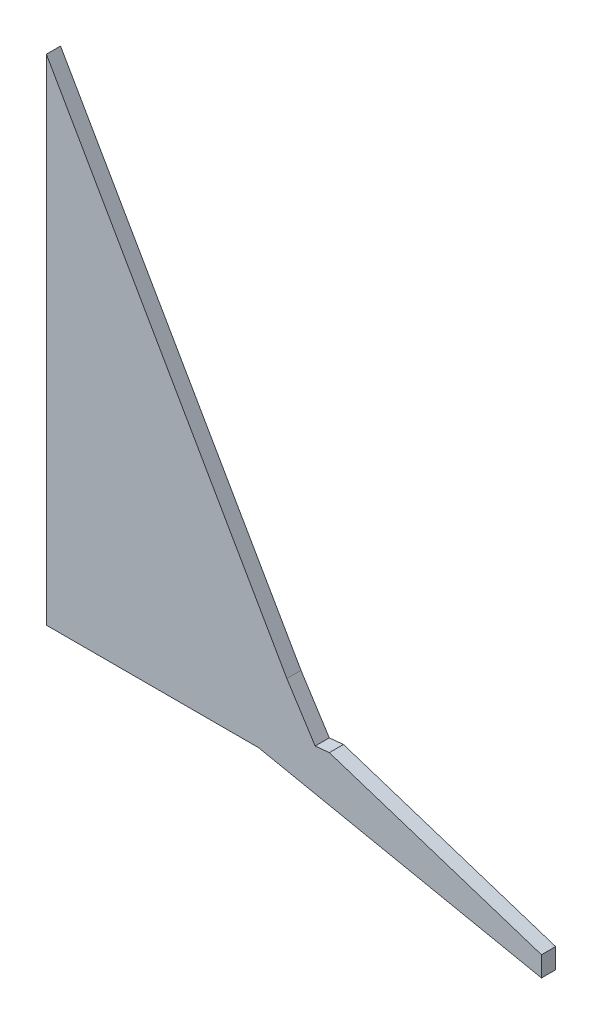
ISO-10303-21;
HEADER;
FILE_DESCRIPTION(('STEP AP214'),'2;1');
FILE_NAME('part.step','',(''),(''),'','','');
FILE_SCHEMA(('AUTOMOTIVE_DESIGN { 1 0 10303 214 1 1 1 1 }'));
ENDSEC;
DATA;
#1=APPLICATION_CONTEXT('core data for automotive mechanical design processes');
#2=APPLICATION_PROTOCOL_DEFINITION('international standard','automotive_design',2000,#1);
#3=PRODUCT_CONTEXT('',#1,'mechanical');
#4=PRODUCT('Part','Part','',(#3));
#5=PRODUCT_RELATED_PRODUCT_CATEGORY('part','',(#4));
#6=PRODUCT_DEFINITION_FORMATION('','',#4);
#7=PRODUCT_DEFINITION_CONTEXT('part definition',#1,'design');
#8=PRODUCT_DEFINITION('design','',#6,#7);
#9=PRODUCT_DEFINITION_SHAPE('','',#8);
#10=(LENGTH_UNIT() NAMED_UNIT(*) SI_UNIT(.MILLI.,.METRE.));
#11=(NAMED_UNIT(*) PLANE_ANGLE_UNIT() SI_UNIT($,.RADIAN.));
#12=(NAMED_UNIT(*) SI_UNIT($,.STERADIAN.) SOLID_ANGLE_UNIT());
#13=UNCERTAINTY_MEASURE_WITH_UNIT(LENGTH_MEASURE(1.E-05),#10,'distance_accuracy_value','');
#14=(GEOMETRIC_REPRESENTATION_CONTEXT(3) GLOBAL_UNCERTAINTY_ASSIGNED_CONTEXT((#13)) GLOBAL_UNIT_ASSIGNED_CONTEXT((#10,
#11,#12)) REPRESENTATION_CONTEXT('',''));
#15=CARTESIAN_POINT('',(0.,0.,0.));
#16=DIRECTION('',(0.,0.,1.));
#17=DIRECTION('',(1.,0.,0.));
#18=AXIS2_PLACEMENT_3D('',#15,#16,#17);
#19=CARTESIAN_POINT('',(104.72813363022,16.993038024931,0.5));
#20=DIRECTION('',(0.,0.,1.));
#21=DIRECTION('',(1.,0.,0.));
#22=AXIS2_PLACEMENT_3D('',#19,#20,#21);
#23=PLANE('',#22);
#24=DIRECTION('',(1.,0.,0.));
#25=VECTOR('',#24,1.);
#26=CARTESIAN_POINT('',(93.,7.,0.5));
#27=LINE('',#26,#25);
#28=CARTESIAN_POINT('',(93.,7.,0.5));
#29=VERTEX_POINT('',#28);
#30=CARTESIAN_POINT('',(108.,7.,0.5));
#31=VERTEX_POINT('',#30);
#32=EDGE_CURVE('E123',#29,#31,#27,.T.);
#33=ORIENTED_EDGE('',*,*,#32,.T.);
#34=DIRECTION('',(0.979627415685857,-0.200823620215971,0.));
#35=VECTOR('',#34,1.);
#36=CARTESIAN_POINT('',(108.,7.,0.5));
#37=LINE('',#36,#35);
#38=CARTESIAN_POINT('',(128.,2.9,0.5));
#39=VERTEX_POINT('',#38);
#40=EDGE_CURVE('E155',#31,#39,#37,.T.);
#41=ORIENTED_EDGE('',*,*,#40,.T.);
#42=DIRECTION('',(0.,1.,0.));
#43=VECTOR('',#42,1.);
#44=CARTESIAN_POINT('',(128.,2.9,0.5));
#45=LINE('',#44,#43);
#46=CARTESIAN_POINT('',(128.,4.323626457744,0.5));
#47=VERTEX_POINT('',#46);
#48=EDGE_CURVE('E142',#39,#47,#45,.T.);
#49=ORIENTED_EDGE('',*,*,#48,.T.);
#50=DIRECTION('',(-0.951056516295123,0.30901699437504,0.));
#51=VECTOR('',#50,1.);
#52=CARTESIAN_POINT('',(128.,4.323626457744,0.5));
#53=LINE('',#52,#51);
#54=CARTESIAN_POINT('',(113.,9.197421901238,0.5));
#55=VERTEX_POINT('',#54);
#56=EDGE_CURVE('E140',#47,#55,#53,.T.);
#57=ORIENTED_EDGE('',*,*,#56,.T.);
#58=DIRECTION('',(-0.99551028623669,-0.0946534204186205,0.));
#59=VECTOR('',#58,1.);
#60=CARTESIAN_POINT('',(113.,9.197421901238,0.5));
#61=LINE('',#60,#59);
#62=CARTESIAN_POINT('',(112.,9.102341597471,0.5));
#63=VERTEX_POINT('',#62);
#64=EDGE_CURVE('E147',#55,#63,#61,.T.);
#65=ORIENTED_EDGE('',*,*,#64,.T.);
#66=DIRECTION('',(-0.538462816065792,0.842649272066675,0.));
#67=VECTOR('',#66,1.);
#68=CARTESIAN_POINT('',(112.,9.102341597471,0.5));
#69=LINE('',#68,#67);
#70=CARTESIAN_POINT('',(110.,12.232174324728,0.5));
#71=VERTEX_POINT('',#70);
#72=EDGE_CURVE('E82',#63,#71,#69,.T.);
#73=ORIENTED_EDGE('',*,*,#72,.T.);
#74=DIRECTION('',(-0.49645511618085,0.868062392698738,0.));
#75=VECTOR('',#74,1.);
#76=CARTESIAN_POINT('',(110.,12.232174324728,0.5));
#77=LINE('',#76,#75);
#78=CARTESIAN_POINT('',(93.,41.957038053398,0.5));
#79=VERTEX_POINT('',#78);
#80=EDGE_CURVE('E116',#71,#79,#77,.T.);
#81=ORIENTED_EDGE('',*,*,#80,.T.);
#82=DIRECTION('',(0.,-1.,0.));
#83=VECTOR('',#82,1.);
#84=CARTESIAN_POINT('',(93.,41.957038053398,0.5));
#85=LINE('',#84,#83);
#86=EDGE_CURVE('E11',#79,#29,#85,.T.);
#87=ORIENTED_EDGE('',*,*,#86,.T.);
#88=EDGE_LOOP('',(#33,#41,#49,#57,#65,#73,#81,#87));
#89=FACE_BOUND('',#88,.T.);
#90=ADVANCED_FACE('F17',(#89),#23,.T.);
#91=CARTESIAN_POINT('',(104.72813363022,16.993038024931,-0.5));
#92=DIRECTION('',(0.,0.,1.));
#93=DIRECTION('',(1.,0.,0.));
#94=AXIS2_PLACEMENT_3D('',#91,#92,#93);
#95=PLANE('',#94);
#96=DIRECTION('',(0.,-1.,0.));
#97=VECTOR('',#96,1.);
#98=CARTESIAN_POINT('',(93.,41.957038053398,-0.5));
#99=LINE('',#98,#97);
#100=CARTESIAN_POINT('',(93.,41.957038053398,-0.5));
#101=VERTEX_POINT('',#100);
#102=CARTESIAN_POINT('',(93.,7.,-0.5));
#103=VERTEX_POINT('',#102);
#104=EDGE_CURVE('E21',#101,#103,#99,.T.);
#105=ORIENTED_EDGE('',*,*,#104,.F.);
#106=DIRECTION('',(-0.49645511618085,0.868062392698738,0.));
#107=VECTOR('',#106,1.);
#108=CARTESIAN_POINT('',(110.,12.232174324728,-0.5));
#109=LINE('',#108,#107);
#110=CARTESIAN_POINT('',(110.,12.232174324728,-0.5));
#111=VERTEX_POINT('',#110);
#112=EDGE_CURVE('E189',#111,#101,#109,.T.);
#113=ORIENTED_EDGE('',*,*,#112,.F.);
#114=DIRECTION('',(-0.538462816065792,0.842649272066675,0.));
#115=VECTOR('',#114,1.);
#116=CARTESIAN_POINT('',(112.,9.102341597471,-0.5));
#117=LINE('',#116,#115);
#118=CARTESIAN_POINT('',(112.,9.102341597471,-0.5));
#119=VERTEX_POINT('',#118);
#120=EDGE_CURVE('E90',#119,#111,#117,.T.);
#121=ORIENTED_EDGE('',*,*,#120,.F.);
#122=DIRECTION('',(-0.99551028623669,-0.0946534204186205,0.));
#123=VECTOR('',#122,1.);
#124=CARTESIAN_POINT('',(113.,9.197421901238,-0.5));
#125=LINE('',#124,#123);
#126=CARTESIAN_POINT('',(113.,9.197421901238,-0.5));
#127=VERTEX_POINT('',#126);
#128=EDGE_CURVE('E173',#127,#119,#125,.T.);
#129=ORIENTED_EDGE('',*,*,#128,.F.);
#130=DIRECTION('',(-0.951056516295123,0.30901699437504,0.));
#131=VECTOR('',#130,1.);
#132=CARTESIAN_POINT('',(128.,4.323626457744,-0.5));
#133=LINE('',#132,#131);
#134=CARTESIAN_POINT('',(128.,4.323626457744,-0.5));
#135=VERTEX_POINT('',#134);
#136=EDGE_CURVE('E141',#135,#127,#133,.T.);
#137=ORIENTED_EDGE('',*,*,#136,.F.);
#138=DIRECTION('',(0.,1.,0.));
#139=VECTOR('',#138,1.);
#140=CARTESIAN_POINT('',(128.,2.9,-0.5));
#141=LINE('',#140,#139);
#142=CARTESIAN_POINT('',(128.,2.9,-0.5));
#143=VERTEX_POINT('',#142);
#144=EDGE_CURVE('E151',#143,#135,#141,.T.);
#145=ORIENTED_EDGE('',*,*,#144,.F.);
#146=DIRECTION('',(0.979627415685857,-0.200823620215971,0.));
#147=VECTOR('',#146,1.);
#148=CARTESIAN_POINT('',(108.,7.,-0.5));
#149=LINE('',#148,#147);
#150=CARTESIAN_POINT('',(108.,7.,-0.5));
#151=VERTEX_POINT('',#150);
#152=EDGE_CURVE('E125',#151,#143,#149,.T.);
#153=ORIENTED_EDGE('',*,*,#152,.F.);
#154=DIRECTION('',(1.,0.,0.));
#155=VECTOR('',#154,1.);
#156=CARTESIAN_POINT('',(93.,7.,-0.5));
#157=LINE('',#156,#155);
#158=EDGE_CURVE('E121',#103,#151,#157,.T.);
#159=ORIENTED_EDGE('',*,*,#158,.F.);
#160=EDGE_LOOP('',(#105,#113,#121,#129,#137,#145,#153,#159));
#161=FACE_BOUND('',#160,.T.);
#162=ADVANCED_FACE('F19',(#161),#95,.F.);
#163=CARTESIAN_POINT('',(93.,41.957038053398,-0.5));
#164=DIRECTION('',(1.,0.,0.));
#165=DIRECTION('',(0.,1.,0.));
#166=AXIS2_PLACEMENT_3D('',#163,#164,#165);
#167=PLANE('',#166);
#168=ORIENTED_EDGE('',*,*,#104,.T.);
#169=DIRECTION('',(0.,0.,1.));
#170=VECTOR('',#169,1.);
#171=CARTESIAN_POINT('',(93.,7.,-0.5));
#172=LINE('',#171,#170);
#173=EDGE_CURVE('E109',#103,#29,#172,.T.);
#174=ORIENTED_EDGE('',*,*,#173,.T.);
#175=ORIENTED_EDGE('',*,*,#86,.F.);
#176=DIRECTION('',(0.,0.,1.));
#177=VECTOR('',#176,1.);
#178=CARTESIAN_POINT('',(93.,41.957038053398,-0.5));
#179=LINE('',#178,#177);
#180=EDGE_CURVE('E112',#101,#79,#179,.T.);
#181=ORIENTED_EDGE('',*,*,#180,.F.);
#182=EDGE_LOOP('',(#168,#174,#175,#181));
#183=FACE_BOUND('',#182,.T.);
#184=ADVANCED_FACE('F108',(#183),#167,.F.);
#185=CARTESIAN_POINT('',(110.,12.232174324728,-0.5));
#186=DIRECTION('',(-0.868062392698738,-0.49645511618085,0.));
#187=DIRECTION('',(-0.49645511618085,0.868062392698738,0.));
#188=AXIS2_PLACEMENT_3D('',#185,#186,#187);
#189=PLANE('',#188);
#190=ORIENTED_EDGE('',*,*,#112,.T.);
#191=ORIENTED_EDGE('',*,*,#180,.T.);
#192=ORIENTED_EDGE('',*,*,#80,.F.);
#193=DIRECTION('',(0.,0.,1.));
#194=VECTOR('',#193,1.);
#195=CARTESIAN_POINT('',(110.,12.232174324728,-0.5));
#196=LINE('',#195,#194);
#197=EDGE_CURVE('E158',#111,#71,#196,.T.);
#198=ORIENTED_EDGE('',*,*,#197,.F.);
#199=EDGE_LOOP('',(#190,#191,#192,#198));
#200=FACE_BOUND('',#199,.T.);
#201=ADVANCED_FACE('F199',(#200),#189,.F.);
#202=CARTESIAN_POINT('',(112.,9.102341597471,-0.5));
#203=DIRECTION('',(-0.842649272066675,-0.538462816065792,0.));
#204=DIRECTION('',(-0.538462816065792,0.842649272066675,0.));
#205=AXIS2_PLACEMENT_3D('',#202,#203,#204);
#206=PLANE('',#205);
#207=ORIENTED_EDGE('',*,*,#120,.T.);
#208=ORIENTED_EDGE('',*,*,#197,.T.);
#209=ORIENTED_EDGE('',*,*,#72,.F.);
#210=DIRECTION('',(0.,0.,1.));
#211=VECTOR('',#210,1.);
#212=CARTESIAN_POINT('',(112.,9.102341597471,-0.5));
#213=LINE('',#212,#211);
#214=EDGE_CURVE('E149',#119,#63,#213,.T.);
#215=ORIENTED_EDGE('',*,*,#214,.F.);
#216=EDGE_LOOP('',(#207,#208,#209,#215));
#217=FACE_BOUND('',#216,.T.);
#218=ADVANCED_FACE('F200',(#217),#206,.F.);
#219=CARTESIAN_POINT('',(113.,9.197421901238,-0.5));
#220=DIRECTION('',(0.0946534204186205,-0.99551028623669,0.));
#221=DIRECTION('',(0.,0.,-1.));
#222=AXIS2_PLACEMENT_3D('',#219,#220,#221);
#223=PLANE('',#222);
#224=ORIENTED_EDGE('',*,*,#128,.T.);
#225=ORIENTED_EDGE('',*,*,#214,.T.);
#226=ORIENTED_EDGE('',*,*,#64,.F.);
#227=DIRECTION('',(0.,0.,1.));
#228=VECTOR('',#227,1.);
#229=CARTESIAN_POINT('',(113.,9.197421901238,-0.5));
#230=LINE('',#229,#228);
#231=EDGE_CURVE('E137',#127,#55,#230,.T.);
#232=ORIENTED_EDGE('',*,*,#231,.F.);
#233=EDGE_LOOP('',(#224,#225,#226,#232));
#234=FACE_BOUND('',#233,.T.);
#235=ADVANCED_FACE('F203',(#234),#223,.F.);
#236=CARTESIAN_POINT('',(128.,4.323626457744,-0.5));
#237=DIRECTION('',(-0.30901699437504,-0.951056516295123,0.));
#238=DIRECTION('',(-0.951056516295123,0.30901699437504,0.));
#239=AXIS2_PLACEMENT_3D('',#236,#237,#238);
#240=PLANE('',#239);
#241=ORIENTED_EDGE('',*,*,#136,.T.);
#242=ORIENTED_EDGE('',*,*,#231,.T.);
#243=ORIENTED_EDGE('',*,*,#56,.F.);
#244=DIRECTION('',(0.,0.,1.));
#245=VECTOR('',#244,1.);
#246=CARTESIAN_POINT('',(128.,4.323626457744,-0.5));
#247=LINE('',#246,#245);
#248=EDGE_CURVE('E146',#135,#47,#247,.T.);
#249=ORIENTED_EDGE('',*,*,#248,.F.);
#250=EDGE_LOOP('',(#241,#242,#243,#249));
#251=FACE_BOUND('',#250,.T.);
#252=ADVANCED_FACE('F207',(#251),#240,.F.);
#253=CARTESIAN_POINT('',(128.,2.9,-0.5));
#254=DIRECTION('',(-1.,0.,0.));
#255=DIRECTION('',(0.,0.,1.));
#256=AXIS2_PLACEMENT_3D('',#253,#254,#255);
#257=PLANE('',#256);
#258=ORIENTED_EDGE('',*,*,#144,.T.);
#259=ORIENTED_EDGE('',*,*,#248,.T.);
#260=ORIENTED_EDGE('',*,*,#48,.F.);
#261=DIRECTION('',(0.,0.,1.));
#262=VECTOR('',#261,1.);
#263=CARTESIAN_POINT('',(128.,2.9,-0.5));
#264=LINE('',#263,#262);
#265=EDGE_CURVE('E163',#143,#39,#264,.T.);
#266=ORIENTED_EDGE('',*,*,#265,.F.);
#267=EDGE_LOOP('',(#258,#259,#260,#266));
#268=FACE_BOUND('',#267,.T.);
#269=ADVANCED_FACE('F209',(#268),#257,.F.);
#270=CARTESIAN_POINT('',(108.,7.,-0.5));
#271=DIRECTION('',(0.200823620215971,0.979627415685857,0.));
#272=DIRECTION('',(0.,0.,-1.));
#273=AXIS2_PLACEMENT_3D('',#270,#271,#272);
#274=PLANE('',#273);
#275=ORIENTED_EDGE('',*,*,#152,.T.);
#276=ORIENTED_EDGE('',*,*,#265,.T.);
#277=ORIENTED_EDGE('',*,*,#40,.F.);
#278=DIRECTION('',(0.,0.,1.));
#279=VECTOR('',#278,1.);
#280=CARTESIAN_POINT('',(108.,7.,-0.5));
#281=LINE('',#280,#279);
#282=EDGE_CURVE('E130',#151,#31,#281,.T.);
#283=ORIENTED_EDGE('',*,*,#282,.F.);
#284=EDGE_LOOP('',(#275,#276,#277,#283));
#285=FACE_BOUND('',#284,.T.);
#286=ADVANCED_FACE('F211',(#285),#274,.F.);
#287=CARTESIAN_POINT('',(93.,7.,-0.5));
#288=DIRECTION('',(0.,1.,0.));
#289=DIRECTION('',(1.,0.,0.));
#290=AXIS2_PLACEMENT_3D('',#287,#288,#289);
#291=PLANE('',#290);
#292=ORIENTED_EDGE('',*,*,#158,.T.);
#293=ORIENTED_EDGE('',*,*,#282,.T.);
#294=ORIENTED_EDGE('',*,*,#32,.F.);
#295=ORIENTED_EDGE('',*,*,#173,.F.);
#296=EDGE_LOOP('',(#292,#293,#294,#295));
#297=FACE_BOUND('',#296,.T.);
#298=ADVANCED_FACE('F119',(#297),#291,.F.);
#299=CLOSED_SHELL('',(#90,#162,#184,#201,#218,#235,#252,#269,#286,#298));
#300=MANIFOLD_SOLID_BREP('B1',#299);
#301=ADVANCED_BREP_SHAPE_REPRESENTATION('',(#18,#300),#14);
#302=SHAPE_DEFINITION_REPRESENTATION(#9,#301);
ENDSEC;
END-ISO-10303-21;
